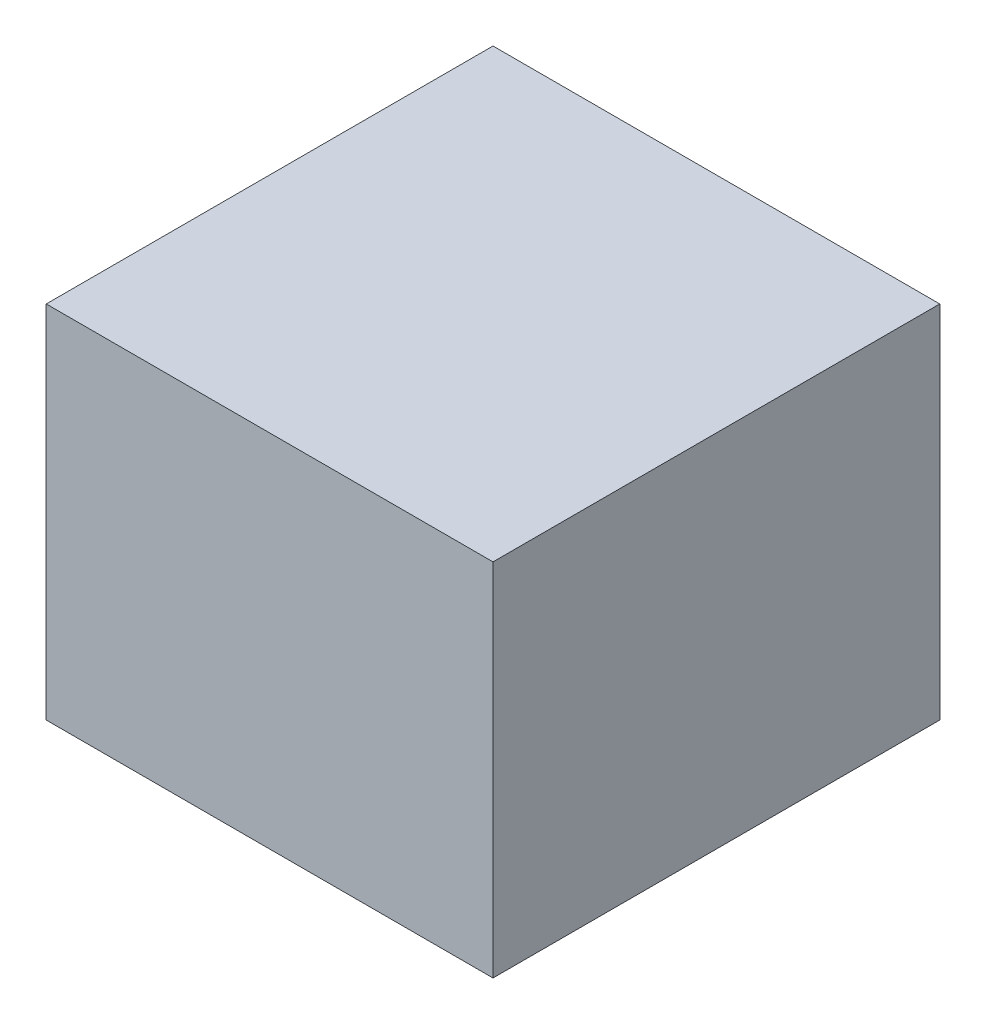
ISO-10303-21;
HEADER;
FILE_DESCRIPTION(('STEP AP214'),'2;1');
FILE_NAME('part.step','',(''),(''),'','','');
FILE_SCHEMA(('AUTOMOTIVE_DESIGN { 1 0 10303 214 1 1 1 1 }'));
ENDSEC;
DATA;
#1=APPLICATION_CONTEXT('core data for automotive mechanical design processes');
#2=APPLICATION_PROTOCOL_DEFINITION('international standard','automotive_design',2000,#1);
#3=PRODUCT_CONTEXT('',#1,'mechanical');
#4=PRODUCT('Part','Part','',(#3));
#5=PRODUCT_RELATED_PRODUCT_CATEGORY('part','',(#4));
#6=PRODUCT_DEFINITION_FORMATION('','',#4);
#7=PRODUCT_DEFINITION_CONTEXT('part definition',#1,'design');
#8=PRODUCT_DEFINITION('design','',#6,#7);
#9=PRODUCT_DEFINITION_SHAPE('','',#8);
#10=(LENGTH_UNIT() NAMED_UNIT(*) SI_UNIT(.MILLI.,.METRE.));
#11=(NAMED_UNIT(*) PLANE_ANGLE_UNIT() SI_UNIT($,.RADIAN.));
#12=(NAMED_UNIT(*) SI_UNIT($,.STERADIAN.) SOLID_ANGLE_UNIT());
#13=UNCERTAINTY_MEASURE_WITH_UNIT(LENGTH_MEASURE(1.E-05),#10,'distance_accuracy_value','');
#14=(GEOMETRIC_REPRESENTATION_CONTEXT(3) GLOBAL_UNCERTAINTY_ASSIGNED_CONTEXT((#13)) GLOBAL_UNIT_ASSIGNED_CONTEXT((#10,
#11,#12)) REPRESENTATION_CONTEXT('',''));
#15=CARTESIAN_POINT('',(0.,0.,0.));
#16=DIRECTION('',(0.,0.,1.));
#17=DIRECTION('',(1.,0.,0.));
#18=AXIS2_PLACEMENT_3D('',#15,#16,#17);
#19=CARTESIAN_POINT('',(0.,36.3,0.));
#20=DIRECTION('',(1.,0.,0.));
#21=DIRECTION('',(0.,0.,-1.));
#22=AXIS2_PLACEMENT_3D('',#19,#20,#21);
#23=PLANE('',#22);
#24=DIRECTION('',(0.,0.,1.));
#25=VECTOR('',#24,1.);
#26=CARTESIAN_POINT('',(0.,0.,0.));
#27=LINE('',#26,#25);
#28=CARTESIAN_POINT('',(0.,0.,-45.));
#29=VERTEX_POINT('',#28);
#30=CARTESIAN_POINT('',(0.,0.,0.));
#31=VERTEX_POINT('',#30);
#32=EDGE_CURVE('E113',#29,#31,#27,.T.);
#33=ORIENTED_EDGE('',*,*,#32,.T.);
#34=DIRECTION('',(0.,-1.,0.));
#35=VECTOR('',#34,1.);
#36=CARTESIAN_POINT('',(0.,36.3,0.));
#37=LINE('',#36,#35);
#38=CARTESIAN_POINT('',(0.,36.3,0.));
#39=VERTEX_POINT('',#38);
#40=EDGE_CURVE('E11',#39,#31,#37,.T.);
#41=ORIENTED_EDGE('',*,*,#40,.F.);
#42=DIRECTION('',(0.,0.,1.));
#43=VECTOR('',#42,1.);
#44=CARTESIAN_POINT('',(0.,36.3,0.));
#45=LINE('',#44,#43);
#46=CARTESIAN_POINT('',(0.,36.3,-45.));
#47=VERTEX_POINT('',#46);
#48=EDGE_CURVE('E97',#47,#39,#45,.T.);
#49=ORIENTED_EDGE('',*,*,#48,.F.);
#50=DIRECTION('',(0.,-1.,0.));
#51=VECTOR('',#50,1.);
#52=CARTESIAN_POINT('',(0.,36.3,-45.));
#53=LINE('',#52,#51);
#54=EDGE_CURVE('E109',#47,#29,#53,.T.);
#55=ORIENTED_EDGE('',*,*,#54,.T.);
#56=EDGE_LOOP('',(#33,#41,#49,#55));
#57=FACE_BOUND('',#56,.T.);
#58=ADVANCED_FACE('F45',(#57),#23,.F.);
#59=CARTESIAN_POINT('',(0.,36.3,0.));
#60=DIRECTION('',(0.,0.,-1.));
#61=DIRECTION('',(-1.,0.,0.));
#62=AXIS2_PLACEMENT_3D('',#59,#60,#61);
#63=PLANE('',#62);
#64=DIRECTION('',(1.,0.,0.));
#65=VECTOR('',#64,1.);
#66=CARTESIAN_POINT('',(0.,0.,0.));
#67=LINE('',#66,#65);
#68=CARTESIAN_POINT('',(45.,0.,0.));
#69=VERTEX_POINT('',#68);
#70=EDGE_CURVE('E102',#31,#69,#67,.T.);
#71=ORIENTED_EDGE('',*,*,#70,.T.);
#72=DIRECTION('',(0.,-1.,0.));
#73=VECTOR('',#72,1.);
#74=CARTESIAN_POINT('',(45.,36.3,0.));
#75=LINE('',#74,#73);
#76=CARTESIAN_POINT('',(45.,36.3,0.));
#77=VERTEX_POINT('',#76);
#78=EDGE_CURVE('E54',#77,#69,#75,.T.);
#79=ORIENTED_EDGE('',*,*,#78,.F.);
#80=DIRECTION('',(1.,0.,0.));
#81=VECTOR('',#80,1.);
#82=CARTESIAN_POINT('',(0.,36.3,0.));
#83=LINE('',#82,#81);
#84=EDGE_CURVE('E92',#39,#77,#83,.T.);
#85=ORIENTED_EDGE('',*,*,#84,.F.);
#86=ORIENTED_EDGE('',*,*,#40,.T.);
#87=EDGE_LOOP('',(#71,#79,#85,#86));
#88=FACE_BOUND('',#87,.T.);
#89=ADVANCED_FACE('F101',(#88),#63,.F.);
#90=CARTESIAN_POINT('',(45.,36.3,0.));
#91=DIRECTION('',(-1.,0.,0.));
#92=DIRECTION('',(0.,0.,1.));
#93=AXIS2_PLACEMENT_3D('',#90,#91,#92);
#94=PLANE('',#93);
#95=DIRECTION('',(0.,0.,-1.));
#96=VECTOR('',#95,1.);
#97=CARTESIAN_POINT('',(45.,0.,0.));
#98=LINE('',#97,#96);
#99=CARTESIAN_POINT('',(45.,0.,-45.));
#100=VERTEX_POINT('',#99);
#101=EDGE_CURVE('E79',#69,#100,#98,.T.);
#102=ORIENTED_EDGE('',*,*,#101,.T.);
#103=DIRECTION('',(0.,-1.,0.));
#104=VECTOR('',#103,1.);
#105=CARTESIAN_POINT('',(45.,36.3,-45.));
#106=LINE('',#105,#104);
#107=CARTESIAN_POINT('',(45.,36.3,-45.));
#108=VERTEX_POINT('',#107);
#109=EDGE_CURVE('E104',#108,#100,#106,.T.);
#110=ORIENTED_EDGE('',*,*,#109,.F.);
#111=DIRECTION('',(0.,0.,-1.));
#112=VECTOR('',#111,1.);
#113=CARTESIAN_POINT('',(45.,36.3,0.));
#114=LINE('',#113,#112);
#115=EDGE_CURVE('E95',#77,#108,#114,.T.);
#116=ORIENTED_EDGE('',*,*,#115,.F.);
#117=ORIENTED_EDGE('',*,*,#78,.T.);
#118=EDGE_LOOP('',(#102,#110,#116,#117));
#119=FACE_BOUND('',#118,.T.);
#120=ADVANCED_FACE('F105',(#119),#94,.F.);
#121=CARTESIAN_POINT('',(0.,36.3,-45.));
#122=DIRECTION('',(0.,0.,1.));
#123=DIRECTION('',(1.,0.,0.));
#124=AXIS2_PLACEMENT_3D('',#121,#122,#123);
#125=PLANE('',#124);
#126=DIRECTION('',(-1.,0.,0.));
#127=VECTOR('',#126,1.);
#128=CARTESIAN_POINT('',(0.,0.,-45.));
#129=LINE('',#128,#127);
#130=EDGE_CURVE('E85',#100,#29,#129,.T.);
#131=ORIENTED_EDGE('',*,*,#130,.T.);
#132=ORIENTED_EDGE('',*,*,#54,.F.);
#133=DIRECTION('',(-1.,0.,0.));
#134=VECTOR('',#133,1.);
#135=CARTESIAN_POINT('',(0.,36.3,-45.));
#136=LINE('',#135,#134);
#137=EDGE_CURVE('E62',#108,#47,#136,.T.);
#138=ORIENTED_EDGE('',*,*,#137,.F.);
#139=ORIENTED_EDGE('',*,*,#109,.T.);
#140=EDGE_LOOP('',(#131,#132,#138,#139));
#141=FACE_BOUND('',#140,.T.);
#142=ADVANCED_FACE('F126',(#141),#125,.F.);
#143=CARTESIAN_POINT('',(0.,36.3,0.));
#144=DIRECTION('',(0.,-1.,0.));
#145=DIRECTION('',(0.,0.,-1.));
#146=AXIS2_PLACEMENT_3D('',#143,#144,#145);
#147=PLANE('',#146);
#148=ORIENTED_EDGE('',*,*,#48,.T.);
#149=ORIENTED_EDGE('',*,*,#84,.T.);
#150=ORIENTED_EDGE('',*,*,#115,.T.);
#151=ORIENTED_EDGE('',*,*,#137,.T.);
#152=EDGE_LOOP('',(#148,#149,#150,#151));
#153=FACE_BOUND('',#152,.T.);
#154=ADVANCED_FACE('F93',(#153),#147,.F.);
#155=CARTESIAN_POINT('',(0.,0.,0.));
#156=DIRECTION('',(0.,-1.,0.));
#157=DIRECTION('',(0.,0.,-1.));
#158=AXIS2_PLACEMENT_3D('',#155,#156,#157);
#159=PLANE('',#158);
#160=ORIENTED_EDGE('',*,*,#32,.F.);
#161=ORIENTED_EDGE('',*,*,#130,.F.);
#162=ORIENTED_EDGE('',*,*,#101,.F.);
#163=ORIENTED_EDGE('',*,*,#70,.F.);
#164=EDGE_LOOP('',(#160,#161,#162,#163));
#165=FACE_BOUND('',#164,.T.);
#166=ADVANCED_FACE('F129',(#165),#159,.T.);
#167=CLOSED_SHELL('',(#58,#89,#120,#142,#154,#166));
#168=MANIFOLD_SOLID_BREP('B2',#167);
#169=ADVANCED_BREP_SHAPE_REPRESENTATION('',(#18,#168),#14);
#170=SHAPE_DEFINITION_REPRESENTATION(#9,#169);
ENDSEC;
END-ISO-10303-21;
